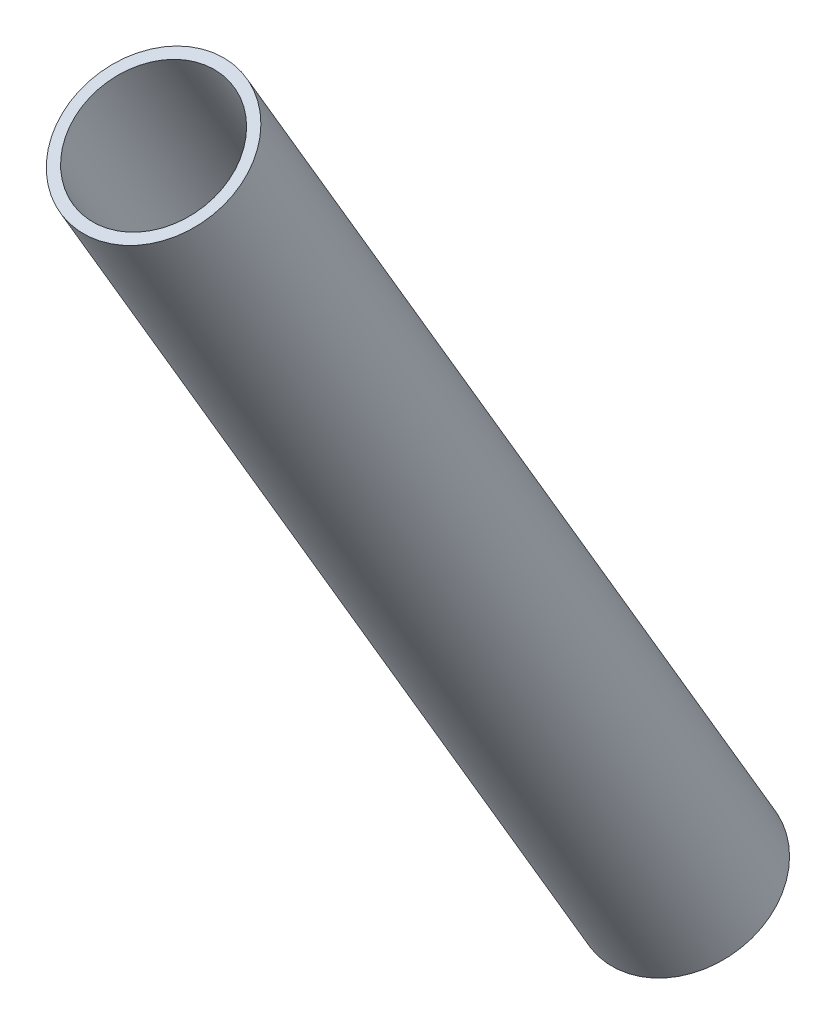
ISO-10303-21;
HEADER;
FILE_DESCRIPTION(('STEP AP214'),'2;1');
FILE_NAME('part.step','',(''),(''),'','','');
FILE_SCHEMA(('AUTOMOTIVE_DESIGN { 1 0 10303 214 1 1 1 1 }'));
ENDSEC;
DATA;
#1=APPLICATION_CONTEXT('core data for automotive mechanical design processes');
#2=APPLICATION_PROTOCOL_DEFINITION('international standard','automotive_design',2000,#1);
#3=PRODUCT_CONTEXT('',#1,'mechanical');
#4=PRODUCT('Part','Part','',(#3));
#5=PRODUCT_RELATED_PRODUCT_CATEGORY('part','',(#4));
#6=PRODUCT_DEFINITION_FORMATION('','',#4);
#7=PRODUCT_DEFINITION_CONTEXT('part definition',#1,'design');
#8=PRODUCT_DEFINITION('design','',#6,#7);
#9=PRODUCT_DEFINITION_SHAPE('','',#8);
#10=(LENGTH_UNIT() NAMED_UNIT(*) SI_UNIT(.MILLI.,.METRE.));
#11=(NAMED_UNIT(*) PLANE_ANGLE_UNIT() SI_UNIT($,.RADIAN.));
#12=(NAMED_UNIT(*) SI_UNIT($,.STERADIAN.) SOLID_ANGLE_UNIT());
#13=UNCERTAINTY_MEASURE_WITH_UNIT(LENGTH_MEASURE(1.E-05),#10,'distance_accuracy_value','');
#14=(GEOMETRIC_REPRESENTATION_CONTEXT(3) GLOBAL_UNCERTAINTY_ASSIGNED_CONTEXT((#13)) GLOBAL_UNIT_ASSIGNED_CONTEXT((#10,
#11,#12)) REPRESENTATION_CONTEXT('',''));
#15=CARTESIAN_POINT('',(0.,0.,0.));
#16=DIRECTION('',(0.,0.,1.));
#17=DIRECTION('',(1.,0.,0.));
#18=AXIS2_PLACEMENT_3D('',#15,#16,#17);
#19=CARTESIAN_POINT('',(0.,189.842593578162,111.662124714494));
#20=DIRECTION('',(0.,-0.861954035177853,-0.506986431022189));
#21=DIRECTION('',(0.,0.506986431022189,-0.861954035177853));
#22=AXIS2_PLACEMENT_3D('',#19,#20,#21);
#23=PLANE('',#22);
#24=CARTESIAN_POINT('',(0.,189.842593578163,111.662124714492));
#25=DIRECTION('',(0.,-0.861954035177853,-0.506986431022189));
#26=DIRECTION('',(0.,0.506986431022189,-0.861954035177853));
#27=AXIS2_PLACEMENT_3D('',#24,#25,#26);
#28=CIRCLE('',#27,14.9999999999976);
#29=CARTESIAN_POINT('',(0.,197.447390043495,98.7328141868263));
#30=VERTEX_POINT('',#29);
#31=EDGE_CURVE('E49',#30,#30,#28,.T.);
#32=ORIENTED_EDGE('',*,*,#31,.F.);
#33=EDGE_LOOP('',(#32));
#34=FACE_BOUND('',#33,.T.);
#35=CARTESIAN_POINT('',(0.,189.842593578163,111.662124714492));
#36=DIRECTION('',(0.,-0.861954035177853,-0.506986431022189));
#37=DIRECTION('',(0.,0.506986431022189,-0.861954035177853));
#38=AXIS2_PLACEMENT_3D('',#35,#36,#37);
#39=CIRCLE('',#38,12.9999999999976);
#40=CARTESIAN_POINT('',(0.,196.43341718145,100.456722257182));
#41=VERTEX_POINT('',#40);
#42=EDGE_CURVE('E10',#41,#41,#39,.T.);
#43=ORIENTED_EDGE('',*,*,#42,.T.);
#44=EDGE_LOOP('',(#43));
#45=FACE_BOUND('',#44,.T.);
#46=ADVANCED_FACE('F35',(#34,#45),#23,.F.);
#47=CARTESIAN_POINT('',(0.,-2.51483838525352E-13,1.12705960447208E-13));
#48=DIRECTION('',(0.,-0.861954035177853,-0.506986431022189));
#49=DIRECTION('',(0.,0.506986431022189,-0.861954035177853));
#50=AXIS2_PLACEMENT_3D('',#47,#48,#49);
#51=CYLINDRICAL_SURFACE('',#50,12.9999999999987);
#52=CARTESIAN_POINT('',(0.,24.0018280592889,14.1174594574251));
#53=DIRECTION('',(0.,-0.861954035177853,-0.506986431022189));
#54=DIRECTION('',(0.,0.506986431022189,-0.861954035177853));
#55=AXIS2_PLACEMENT_3D('',#52,#53,#54);
#56=CIRCLE('',#55,12.9999999999999);
#57=CARTESIAN_POINT('',(0.,30.5926516625773,2.91205700011312));
#58=VERTEX_POINT('',#57);
#59=EDGE_CURVE('E41',#58,#58,#56,.T.);
#60=ORIENTED_EDGE('',*,*,#59,.T.);
#61=EDGE_LOOP('',(#60));
#62=FACE_BOUND('',#61,.T.);
#63=ORIENTED_EDGE('',*,*,#42,.F.);
#64=EDGE_LOOP('',(#63));
#65=FACE_BOUND('',#64,.T.);
#66=ADVANCED_FACE('F58',(#62,#65),#51,.F.);
#67=CARTESIAN_POINT('',(0.,24.0018280592888,14.1174594574253));
#68=DIRECTION('',(0.,0.861954035177853,0.506986431022189));
#69=DIRECTION('',(0.,-0.506986431022189,0.861954035177853));
#70=AXIS2_PLACEMENT_3D('',#67,#68,#69);
#71=PLANE('',#70);
#72=ORIENTED_EDGE('',*,*,#59,.F.);
#73=EDGE_LOOP('',(#72));
#74=FACE_BOUND('',#73,.T.);
#75=CARTESIAN_POINT('',(0.,24.0018280592889,14.1174594574251));
#76=DIRECTION('',(0.,-0.861954035177853,-0.506986431022189));
#77=DIRECTION('',(0.,0.506986431022189,-0.861954035177853));
#78=AXIS2_PLACEMENT_3D('',#75,#76,#77);
#79=CIRCLE('',#78,14.9999999999997);
#80=CARTESIAN_POINT('',(0.,31.6066245246216,1.1881489297576));
#81=VERTEX_POINT('',#80);
#82=EDGE_CURVE('E45',#81,#81,#79,.T.);
#83=ORIENTED_EDGE('',*,*,#82,.T.);
#84=EDGE_LOOP('',(#83));
#85=FACE_BOUND('',#84,.T.);
#86=ADVANCED_FACE('F62',(#74,#85),#71,.F.);
#87=CARTESIAN_POINT('',(0.,-2.51483838525352E-13,1.12705960447208E-13));
#88=DIRECTION('',(0.,-0.861954035177853,-0.506986431022189));
#89=DIRECTION('',(0.,0.506986431022189,-0.861954035177853));
#90=AXIS2_PLACEMENT_3D('',#87,#88,#89);
#91=CYLINDRICAL_SURFACE('',#90,14.9999999999986);
#92=ORIENTED_EDGE('',*,*,#82,.F.);
#93=EDGE_LOOP('',(#92));
#94=FACE_BOUND('',#93,.T.);
#95=ORIENTED_EDGE('',*,*,#31,.T.);
#96=EDGE_LOOP('',(#95));
#97=FACE_BOUND('',#96,.T.);
#98=ADVANCED_FACE('F55',(#94,#97),#91,.T.);
#99=CLOSED_SHELL('',(#46,#66,#86,#98));
#100=MANIFOLD_SOLID_BREP('B2',#99);
#101=ADVANCED_BREP_SHAPE_REPRESENTATION('',(#18,#100),#14);
#102=SHAPE_DEFINITION_REPRESENTATION(#9,#101);
ENDSEC;
END-ISO-10303-21;
